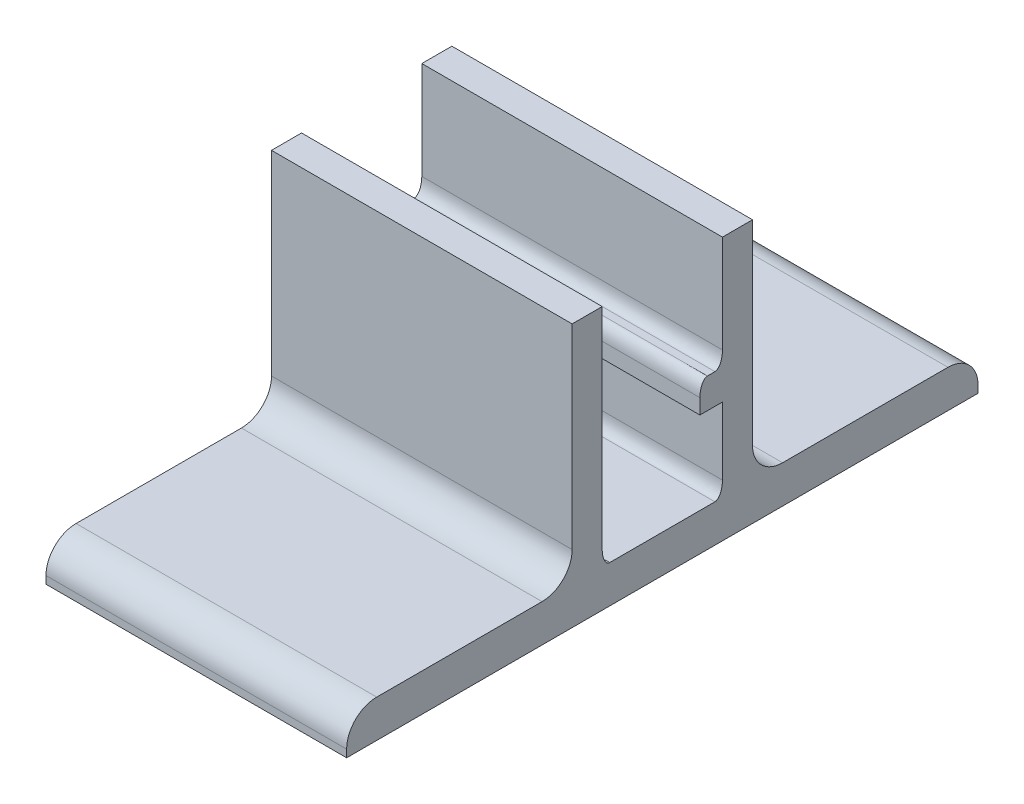
ISO-10303-21;
HEADER;
FILE_DESCRIPTION(('STEP AP214'),'2;1');
FILE_NAME('part.step','',(''),(''),'','','');
FILE_SCHEMA(('AUTOMOTIVE_DESIGN { 1 0 10303 214 1 1 1 1 }'));
ENDSEC;
DATA;
#1=APPLICATION_CONTEXT('core data for automotive mechanical design processes');
#2=APPLICATION_PROTOCOL_DEFINITION('international standard','automotive_design',2000,#1);
#3=PRODUCT_CONTEXT('',#1,'mechanical');
#4=PRODUCT('Part','Part','',(#3));
#5=PRODUCT_RELATED_PRODUCT_CATEGORY('part','',(#4));
#6=PRODUCT_DEFINITION_FORMATION('','',#4);
#7=PRODUCT_DEFINITION_CONTEXT('part definition',#1,'design');
#8=PRODUCT_DEFINITION('design','',#6,#7);
#9=PRODUCT_DEFINITION_SHAPE('','',#8);
#10=(LENGTH_UNIT() NAMED_UNIT(*) SI_UNIT(.MILLI.,.METRE.));
#11=(NAMED_UNIT(*) PLANE_ANGLE_UNIT() SI_UNIT($,.RADIAN.));
#12=(NAMED_UNIT(*) SI_UNIT($,.STERADIAN.) SOLID_ANGLE_UNIT());
#13=UNCERTAINTY_MEASURE_WITH_UNIT(LENGTH_MEASURE(1.E-05),#10,'distance_accuracy_value','');
#14=(GEOMETRIC_REPRESENTATION_CONTEXT(3) GLOBAL_UNCERTAINTY_ASSIGNED_CONTEXT((#13)) GLOBAL_UNIT_ASSIGNED_CONTEXT((#10,
#11,#12)) REPRESENTATION_CONTEXT('',''));
#15=CARTESIAN_POINT('',(0.,0.,0.));
#16=DIRECTION('',(0.,0.,1.));
#17=DIRECTION('',(1.,0.,0.));
#18=AXIS2_PLACEMENT_3D('',#15,#16,#17);
#19=CARTESIAN_POINT('',(50.8,6.35,-63.5));
#20=DIRECTION('',(0.,0.,-1.));
#21=DIRECTION('',(-1.,0.,0.));
#22=AXIS2_PLACEMENT_3D('',#19,#20,#21);
#23=PLANE('',#22);
#24=DIRECTION('',(0.,-1.,0.));
#25=VECTOR('',#24,1.);
#26=CARTESIAN_POINT('',(0.,6.35,-63.5));
#27=LINE('',#26,#25);
#28=CARTESIAN_POINT('',(0.,20.32,-63.5));
#29=VERTEX_POINT('',#28);
#30=CARTESIAN_POINT('',(0.,8.89,-63.5));
#31=VERTEX_POINT('',#30);
#32=EDGE_CURVE('E240',#29,#31,#27,.T.);
#33=ORIENTED_EDGE('',*,*,#32,.T.);
#34=CARTESIAN_POINT('',(53.34,8.89,-63.5));
#35=CARTESIAN_POINT('',(34.7133333333333,8.89,-63.5));
#36=CARTESIAN_POINT('',(16.0866666666666,8.89,-63.5));
#37=CARTESIAN_POINT('',(-2.54,8.89,-63.5));
#38=(BOUNDED_CURVE() B_SPLINE_CURVE(3,(#34,#35,#36,#37),.UNSPECIFIED.,.F.,
.F.) B_SPLINE_CURVE_WITH_KNOTS((4,4),(-0.05334,0.00254),
.UNSPECIFIED.) CURVE() GEOMETRIC_REPRESENTATION_ITEM() RATIONAL_B_SPLINE_CURVE((1.,1.,1.,1.)) REPRESENTATION_ITEM(''));
#39=CARTESIAN_POINT('',(50.8,8.89,-63.5));
#40=VERTEX_POINT('',#39);
#41=EDGE_CURVE('E672',#31,#40,#38,.F.);
#42=ORIENTED_EDGE('',*,*,#41,.T.);
#43=DIRECTION('',(0.,-1.,0.));
#44=VECTOR('',#43,1.);
#45=CARTESIAN_POINT('',(50.8,6.35,-63.5));
#46=LINE('',#45,#44);
#47=CARTESIAN_POINT('',(50.8,20.32,-63.5));
#48=VERTEX_POINT('',#47);
#49=EDGE_CURVE('E305',#48,#40,#46,.T.);
#50=ORIENTED_EDGE('',*,*,#49,.F.);
#51=DIRECTION('',(1.,0.,0.));
#52=VECTOR('',#51,1.);
#53=CARTESIAN_POINT('',(0.,20.32,-63.5));
#54=LINE('',#53,#52);
#55=EDGE_CURVE('E237',#29,#48,#54,.T.);
#56=ORIENTED_EDGE('',*,*,#55,.F.);
#57=EDGE_LOOP('',(#33,#42,#50,#56));
#58=FACE_BOUND('',#57,.T.);
#59=ADVANCED_FACE('F48',(#58),#23,.F.);
#60=CARTESIAN_POINT('',(50.8,6.35,0.));
#61=DIRECTION('',(0.,0.,-1.));
#62=DIRECTION('',(0.,1.,0.));
#63=AXIS2_PLACEMENT_3D('',#60,#61,#62);
#64=PLANE('',#63);
#65=DIRECTION('',(0.,-1.,0.));
#66=VECTOR('',#65,1.);
#67=CARTESIAN_POINT('',(50.8,6.35,0.));
#68=LINE('',#67,#66);
#69=CARTESIAN_POINT('',(50.8,1.27,0.));
#70=VERTEX_POINT('',#69);
#71=CARTESIAN_POINT('',(50.8,0.,0.));
#72=VERTEX_POINT('',#71);
#73=EDGE_CURVE('E759',#70,#72,#68,.T.);
#74=ORIENTED_EDGE('',*,*,#73,.F.);
#75=DIRECTION('',(-1.,0.,0.));
#76=VECTOR('',#75,1.);
#77=CARTESIAN_POINT('',(50.8,1.27,0.));
#78=LINE('',#77,#76);
#79=CARTESIAN_POINT('',(0.,1.27,0.));
#80=VERTEX_POINT('',#79);
#81=EDGE_CURVE('E413',#70,#80,#78,.T.);
#82=ORIENTED_EDGE('',*,*,#81,.T.);
#83=DIRECTION('',(0.,-1.,0.));
#84=VECTOR('',#83,1.);
#85=CARTESIAN_POINT('',(0.,6.35,0.));
#86=LINE('',#85,#84);
#87=CARTESIAN_POINT('',(0.,0.,0.));
#88=VERTEX_POINT('',#87);
#89=EDGE_CURVE('E779',#80,#88,#86,.T.);
#90=ORIENTED_EDGE('',*,*,#89,.T.);
#91=DIRECTION('',(-1.,0.,0.));
#92=VECTOR('',#91,1.);
#93=CARTESIAN_POINT('',(50.8,0.,0.));
#94=LINE('',#93,#92);
#95=EDGE_CURVE('E373',#72,#88,#94,.T.);
#96=ORIENTED_EDGE('',*,*,#95,.F.);
#97=EDGE_LOOP('',(#74,#82,#90,#96));
#98=FACE_BOUND('',#97,.T.);
#99=ADVANCED_FACE('F814',(#98),#64,.F.);
#100=CARTESIAN_POINT('',(50.8,0.,0.));
#101=DIRECTION('',(0.,1.,0.));
#102=DIRECTION('',(0.,0.,1.));
#103=AXIS2_PLACEMENT_3D('',#100,#101,#102);
#104=PLANE('',#103);
#105=DIRECTION('',(0.,0.,-1.));
#106=VECTOR('',#105,1.);
#107=CARTESIAN_POINT('',(0.,0.,0.));
#108=LINE('',#107,#106);
#109=CARTESIAN_POINT('',(0.,0.,-106.68));
#110=VERTEX_POINT('',#109);
#111=EDGE_CURVE('E452',#88,#110,#108,.T.);
#112=ORIENTED_EDGE('',*,*,#111,.T.);
#113=DIRECTION('',(-1.,0.,0.));
#114=VECTOR('',#113,1.);
#115=CARTESIAN_POINT('',(50.8,0.,-106.68));
#116=LINE('',#115,#114);
#117=CARTESIAN_POINT('',(50.8,0.,-106.68));
#118=VERTEX_POINT('',#117);
#119=EDGE_CURVE('E363',#118,#110,#116,.T.);
#120=ORIENTED_EDGE('',*,*,#119,.F.);
#121=DIRECTION('',(0.,0.,-1.));
#122=VECTOR('',#121,1.);
#123=CARTESIAN_POINT('',(50.8,0.,0.));
#124=LINE('',#123,#122);
#125=EDGE_CURVE('E799',#72,#118,#124,.T.);
#126=ORIENTED_EDGE('',*,*,#125,.F.);
#127=ORIENTED_EDGE('',*,*,#95,.T.);
#128=EDGE_LOOP('',(#112,#120,#126,#127));
#129=FACE_BOUND('',#128,.T.);
#130=ADVANCED_FACE('F785',(#129),#104,.F.);
#131=CARTESIAN_POINT('',(50.8,0.,-106.68));
#132=DIRECTION('',(0.,0.,1.));
#133=DIRECTION('',(1.,0.,0.));
#134=AXIS2_PLACEMENT_3D('',#131,#132,#133);
#135=PLANE('',#134);
#136=DIRECTION('',(0.,1.,0.));
#137=VECTOR('',#136,1.);
#138=CARTESIAN_POINT('',(0.,0.,-106.68));
#139=LINE('',#138,#137);
#140=CARTESIAN_POINT('',(0.,1.27,-106.68));
#141=VERTEX_POINT('',#140);
#142=EDGE_CURVE('E446',#110,#141,#139,.T.);
#143=ORIENTED_EDGE('',*,*,#142,.T.);
#144=DIRECTION('',(-1.,0.,0.));
#145=VECTOR('',#144,1.);
#146=CARTESIAN_POINT('',(50.8,1.27,-106.68));
#147=LINE('',#146,#145);
#148=CARTESIAN_POINT('',(50.8,1.27,-106.68));
#149=VERTEX_POINT('',#148);
#150=EDGE_CURVE('E404',#141,#149,#147,.F.);
#151=ORIENTED_EDGE('',*,*,#150,.T.);
#152=DIRECTION('',(0.,1.,0.));
#153=VECTOR('',#152,1.);
#154=CARTESIAN_POINT('',(50.8,0.,-106.68));
#155=LINE('',#154,#153);
#156=EDGE_CURVE('E795',#118,#149,#155,.T.);
#157=ORIENTED_EDGE('',*,*,#156,.F.);
#158=ORIENTED_EDGE('',*,*,#119,.T.);
#159=EDGE_LOOP('',(#143,#151,#157,#158));
#160=FACE_BOUND('',#159,.T.);
#161=ADVANCED_FACE('F792',(#160),#135,.F.);
#162=CARTESIAN_POINT('',(50.8,6.35,-68.58));
#163=DIRECTION('',(0.,-1.,0.));
#164=DIRECTION('',(0.,0.,-1.));
#165=AXIS2_PLACEMENT_3D('',#162,#163,#164);
#166=PLANE('',#165);
#167=DIRECTION('',(0.,0.,1.));
#168=VECTOR('',#167,1.);
#169=CARTESIAN_POINT('',(0.,6.35,-68.58));
#170=LINE('',#169,#168);
#171=CARTESIAN_POINT('',(0.,6.35,-101.6));
#172=VERTEX_POINT('',#171);
#173=CARTESIAN_POINT('',(0.,6.35,-73.66));
#174=VERTEX_POINT('',#173);
#175=EDGE_CURVE('E440',#172,#174,#170,.T.);
#176=ORIENTED_EDGE('',*,*,#175,.T.);
#177=DIRECTION('',(-1.,0.,0.));
#178=VECTOR('',#177,1.);
#179=CARTESIAN_POINT('',(50.8,6.35,-73.66));
#180=LINE('',#179,#178);
#181=CARTESIAN_POINT('',(50.8,6.35,-73.66));
#182=VERTEX_POINT('',#181);
#183=EDGE_CURVE('E395',#174,#182,#180,.F.);
#184=ORIENTED_EDGE('',*,*,#183,.T.);
#185=DIRECTION('',(0.,0.,1.));
#186=VECTOR('',#185,1.);
#187=CARTESIAN_POINT('',(50.8,6.35,-68.58));
#188=LINE('',#187,#186);
#189=CARTESIAN_POINT('',(50.8,6.35,-101.6));
#190=VERTEX_POINT('',#189);
#191=EDGE_CURVE('E429',#190,#182,#188,.T.);
#192=ORIENTED_EDGE('',*,*,#191,.F.);
#193=DIRECTION('',(-1.,0.,0.));
#194=VECTOR('',#193,1.);
#195=CARTESIAN_POINT('',(50.8,6.35,-101.6));
#196=LINE('',#195,#194);
#197=EDGE_CURVE('E391',#190,#172,#196,.T.);
#198=ORIENTED_EDGE('',*,*,#197,.T.);
#199=EDGE_LOOP('',(#176,#184,#192,#198));
#200=FACE_BOUND('',#199,.T.);
#201=ADVANCED_FACE('F443',(#200),#166,.F.);
#202=CARTESIAN_POINT('',(50.8,44.45,-68.58));
#203=DIRECTION('',(0.,0.,1.));
#204=DIRECTION('',(1.,0.,0.));
#205=AXIS2_PLACEMENT_3D('',#202,#203,#204);
#206=PLANE('',#205);
#207=DIRECTION('',(0.,1.,0.));
#208=VECTOR('',#207,1.);
#209=CARTESIAN_POINT('',(50.8,44.45,-68.58));
#210=LINE('',#209,#208);
#211=CARTESIAN_POINT('',(50.8,11.43,-68.58));
#212=VERTEX_POINT('',#211);
#213=CARTESIAN_POINT('',(50.8,44.45,-68.58));
#214=VERTEX_POINT('',#213);
#215=EDGE_CURVE('E348',#212,#214,#210,.T.);
#216=ORIENTED_EDGE('',*,*,#215,.F.);
#217=DIRECTION('',(-1.,0.,0.));
#218=VECTOR('',#217,1.);
#219=CARTESIAN_POINT('',(0.,11.43,-68.58));
#220=LINE('',#219,#218);
#221=CARTESIAN_POINT('',(0.,11.43,-68.58));
#222=VERTEX_POINT('',#221);
#223=EDGE_CURVE('E387',#212,#222,#220,.T.);
#224=ORIENTED_EDGE('',*,*,#223,.T.);
#225=DIRECTION('',(0.,1.,0.));
#226=VECTOR('',#225,1.);
#227=CARTESIAN_POINT('',(0.,44.45,-68.58));
#228=LINE('',#227,#226);
#229=CARTESIAN_POINT('',(0.,44.45,-68.58));
#230=VERTEX_POINT('',#229);
#231=EDGE_CURVE('E441',#222,#230,#228,.T.);
#232=ORIENTED_EDGE('',*,*,#231,.T.);
#233=DIRECTION('',(-1.,0.,0.));
#234=VECTOR('',#233,1.);
#235=CARTESIAN_POINT('',(50.8,44.45,-68.58));
#236=LINE('',#235,#234);
#237=EDGE_CURVE('E358',#214,#230,#236,.T.);
#238=ORIENTED_EDGE('',*,*,#237,.F.);
#239=EDGE_LOOP('',(#216,#224,#232,#238));
#240=FACE_BOUND('',#239,.T.);
#241=ADVANCED_FACE('F434',(#240),#206,.F.);
#242=CARTESIAN_POINT('',(50.8,44.45,-63.5));
#243=DIRECTION('',(0.,-1.,0.));
#244=DIRECTION('',(0.,0.,-1.));
#245=AXIS2_PLACEMENT_3D('',#242,#243,#244);
#246=PLANE('',#245);
#247=DIRECTION('',(0.,0.,1.));
#248=VECTOR('',#247,1.);
#249=CARTESIAN_POINT('',(0.,44.45,-63.5));
#250=LINE('',#249,#248);
#251=CARTESIAN_POINT('',(0.,44.45,-63.5));
#252=VERTEX_POINT('',#251);
#253=EDGE_CURVE('E356',#230,#252,#250,.T.);
#254=ORIENTED_EDGE('',*,*,#253,.T.);
#255=DIRECTION('',(-1.,0.,0.));
#256=VECTOR('',#255,1.);
#257=CARTESIAN_POINT('',(50.8,44.45,-63.5));
#258=LINE('',#257,#256);
#259=CARTESIAN_POINT('',(50.8,44.45,-63.5));
#260=VERTEX_POINT('',#259);
#261=EDGE_CURVE('E353',#260,#252,#258,.T.);
#262=ORIENTED_EDGE('',*,*,#261,.F.);
#263=DIRECTION('',(0.,0.,1.));
#264=VECTOR('',#263,1.);
#265=CARTESIAN_POINT('',(50.8,44.45,-63.5));
#266=LINE('',#265,#264);
#267=EDGE_CURVE('E311',#214,#260,#266,.T.);
#268=ORIENTED_EDGE('',*,*,#267,.F.);
#269=ORIENTED_EDGE('',*,*,#237,.T.);
#270=EDGE_LOOP('',(#254,#262,#268,#269));
#271=FACE_BOUND('',#270,.T.);
#272=ADVANCED_FACE('F354',(#271),#246,.F.);
#273=CARTESIAN_POINT('',(0.,27.94,-63.5));
#274=VERTEX_POINT('',#273);
#275=EDGE_CURVE('E325',#252,#274,#27,.T.);
#276=ORIENTED_EDGE('',*,*,#275,.T.);
#277=CARTESIAN_POINT('',(53.34,27.94,-63.5));
#278=CARTESIAN_POINT('',(34.7133333333333,27.94,-63.5));
#279=CARTESIAN_POINT('',(16.0866666666666,27.94,-63.5));
#280=CARTESIAN_POINT('',(-2.54,27.94,-63.5));
#281=(BOUNDED_CURVE() B_SPLINE_CURVE(3,(#277,#278,#279,#280),.UNSPECIFIED.,.F.,
.F.) B_SPLINE_CURVE_WITH_KNOTS((4,4),(-0.05334,0.00254),
.UNSPECIFIED.) CURVE() GEOMETRIC_REPRESENTATION_ITEM() RATIONAL_B_SPLINE_CURVE((1.,1.,1.,1.)) REPRESENTATION_ITEM(''));
#282=CARTESIAN_POINT('',(50.8,27.94,-63.5));
#283=VERTEX_POINT('',#282);
#284=EDGE_CURVE('E333',#274,#283,#281,.F.);
#285=ORIENTED_EDGE('',*,*,#284,.T.);
#286=EDGE_CURVE('E310',#260,#283,#46,.T.);
#287=ORIENTED_EDGE('',*,*,#286,.F.);
#288=ORIENTED_EDGE('',*,*,#261,.T.);
#289=EDGE_LOOP('',(#276,#285,#287,#288));
#290=FACE_BOUND('',#289,.T.);
#291=ADVANCED_FACE('F334',(#290),#23,.F.);
#292=CARTESIAN_POINT('',(50.8,6.35,-43.18));
#293=DIRECTION('',(0.,-1.,0.));
#294=DIRECTION('',(0.,0.,-1.));
#295=AXIS2_PLACEMENT_3D('',#292,#293,#294);
#296=PLANE('',#295);
#297=DIRECTION('',(0.,0.,1.));
#298=VECTOR('',#297,1.);
#299=CARTESIAN_POINT('',(50.8,6.35,-43.18));
#300=LINE('',#299,#298);
#301=CARTESIAN_POINT('',(50.8,6.35,-62.23));
#302=VERTEX_POINT('',#301);
#303=CARTESIAN_POINT('',(50.8,6.35,-44.45));
#304=VERTEX_POINT('',#303);
#305=EDGE_CURVE('E312',#302,#304,#300,.T.);
#306=ORIENTED_EDGE('',*,*,#305,.F.);
#307=CARTESIAN_POINT('',(-2.54,6.35,-62.23));
#308=CARTESIAN_POINT('',(16.0866666666666,6.35,-62.23));
#309=CARTESIAN_POINT('',(34.7133333333333,6.35,-62.23));
#310=CARTESIAN_POINT('',(53.34,6.35,-62.23));
#311=(BOUNDED_CURVE() B_SPLINE_CURVE(3,(#307,#308,#309,#310),.UNSPECIFIED.,.F.,
.F.) B_SPLINE_CURVE_WITH_KNOTS((4,4),(-0.05334,0.00254),
.UNSPECIFIED.) CURVE() GEOMETRIC_REPRESENTATION_ITEM() RATIONAL_B_SPLINE_CURVE((1.,1.,1.,1.)) REPRESENTATION_ITEM(''));
#312=CARTESIAN_POINT('',(0.,6.35,-62.23));
#313=VERTEX_POINT('',#312);
#314=EDGE_CURVE('E715',#302,#313,#311,.F.);
#315=ORIENTED_EDGE('',*,*,#314,.T.);
#316=DIRECTION('',(0.,0.,1.));
#317=VECTOR('',#316,1.);
#318=CARTESIAN_POINT('',(0.,6.35,-43.18));
#319=LINE('',#318,#317);
#320=CARTESIAN_POINT('',(0.,6.35,-44.45));
#321=VERTEX_POINT('',#320);
#322=EDGE_CURVE('E466',#313,#321,#319,.T.);
#323=ORIENTED_EDGE('',*,*,#322,.T.);
#324=CARTESIAN_POINT('',(53.34,6.35,-44.45));
#325=CARTESIAN_POINT('',(34.7133333333333,6.35,-44.45));
#326=CARTESIAN_POINT('',(16.0866666666666,6.35,-44.45));
#327=CARTESIAN_POINT('',(-2.54,6.35,-44.45));
#328=(BOUNDED_CURVE() B_SPLINE_CURVE(3,(#324,#325,#326,#327),.UNSPECIFIED.,.F.,
.F.) B_SPLINE_CURVE_WITH_KNOTS((4,4),(-0.05334,0.00254),
.UNSPECIFIED.) CURVE() GEOMETRIC_REPRESENTATION_ITEM() RATIONAL_B_SPLINE_CURVE((1.,1.,1.,1.)) REPRESENTATION_ITEM(''));
#329=EDGE_CURVE('E712',#321,#304,#328,.F.);
#330=ORIENTED_EDGE('',*,*,#329,.T.);
#331=EDGE_LOOP('',(#306,#315,#323,#330));
#332=FACE_BOUND('',#331,.T.);
#333=ADVANCED_FACE('F738',(#332),#296,.F.);
#334=CARTESIAN_POINT('',(50.8,44.45,-43.18));
#335=DIRECTION('',(0.,0.,1.));
#336=DIRECTION('',(0.,-1.,0.));
#337=AXIS2_PLACEMENT_3D('',#334,#335,#336);
#338=PLANE('',#337);
#339=DIRECTION('',(0.,1.,0.));
#340=VECTOR('',#339,1.);
#341=CARTESIAN_POINT('',(50.8,44.45,-43.18));
#342=LINE('',#341,#340);
#343=CARTESIAN_POINT('',(50.8,8.89000000000003,-43.18));
#344=VERTEX_POINT('',#343);
#345=CARTESIAN_POINT('',(50.8,44.45,-43.18));
#346=VERTEX_POINT('',#345);
#347=EDGE_CURVE('E1117',#344,#346,#342,.T.);
#348=ORIENTED_EDGE('',*,*,#347,.F.);
#349=CARTESIAN_POINT('',(-2.54,8.89,-43.18));
#350=CARTESIAN_POINT('',(16.0866666666666,8.89,-43.18));
#351=CARTESIAN_POINT('',(34.7133333333333,8.89,-43.18));
#352=CARTESIAN_POINT('',(53.34,8.89,-43.18));
#353=(BOUNDED_CURVE() B_SPLINE_CURVE(3,(#349,#350,#351,#352),.UNSPECIFIED.,.F.,
.F.) B_SPLINE_CURVE_WITH_KNOTS((4,4),(-0.05334,0.00254),
.UNSPECIFIED.) CURVE() GEOMETRIC_REPRESENTATION_ITEM() RATIONAL_B_SPLINE_CURVE((1.,1.,1.,1.)) REPRESENTATION_ITEM(''));
#354=CARTESIAN_POINT('',(0.,8.89000000000003,-43.18));
#355=VERTEX_POINT('',#354);
#356=EDGE_CURVE('E695',#344,#355,#353,.F.);
#357=ORIENTED_EDGE('',*,*,#356,.T.);
#358=DIRECTION('',(0.,1.,0.));
#359=VECTOR('',#358,1.);
#360=CARTESIAN_POINT('',(0.,44.45,-43.18));
#361=LINE('',#360,#359);
#362=CARTESIAN_POINT('',(0.,44.45,-43.18));
#363=VERTEX_POINT('',#362);
#364=EDGE_CURVE('E740',#355,#363,#361,.T.);
#365=ORIENTED_EDGE('',*,*,#364,.T.);
#366=DIRECTION('',(-1.,0.,0.));
#367=VECTOR('',#366,1.);
#368=CARTESIAN_POINT('',(50.8,44.45,-43.18));
#369=LINE('',#368,#367);
#370=EDGE_CURVE('E359',#346,#363,#369,.T.);
#371=ORIENTED_EDGE('',*,*,#370,.F.);
#372=EDGE_LOOP('',(#348,#357,#365,#371));
#373=FACE_BOUND('',#372,.T.);
#374=ADVANCED_FACE('F837',(#373),#338,.F.);
#375=CARTESIAN_POINT('',(50.8,44.45,-38.1));
#376=DIRECTION('',(0.,-1.,0.));
#377=DIRECTION('',(0.,0.,-1.));
#378=AXIS2_PLACEMENT_3D('',#375,#376,#377);
#379=PLANE('',#378);
#380=DIRECTION('',(0.,0.,1.));
#381=VECTOR('',#380,1.);
#382=CARTESIAN_POINT('',(0.,44.45,-38.1));
#383=LINE('',#382,#381);
#384=CARTESIAN_POINT('',(0.,44.45,-38.1));
#385=VERTEX_POINT('',#384);
#386=EDGE_CURVE('E743',#363,#385,#383,.T.);
#387=ORIENTED_EDGE('',*,*,#386,.T.);
#388=DIRECTION('',(-1.,0.,0.));
#389=VECTOR('',#388,1.);
#390=CARTESIAN_POINT('',(50.8,44.45,-38.1));
#391=LINE('',#390,#389);
#392=CARTESIAN_POINT('',(50.8,44.45,-38.1));
#393=VERTEX_POINT('',#392);
#394=EDGE_CURVE('E366',#393,#385,#391,.T.);
#395=ORIENTED_EDGE('',*,*,#394,.F.);
#396=DIRECTION('',(0.,0.,1.));
#397=VECTOR('',#396,1.);
#398=CARTESIAN_POINT('',(50.8,44.45,-38.1));
#399=LINE('',#398,#397);
#400=EDGE_CURVE('E775',#346,#393,#399,.T.);
#401=ORIENTED_EDGE('',*,*,#400,.F.);
#402=ORIENTED_EDGE('',*,*,#370,.T.);
#403=EDGE_LOOP('',(#387,#395,#401,#402));
#404=FACE_BOUND('',#403,.T.);
#405=ADVANCED_FACE('F896',(#404),#379,.F.);
#406=CARTESIAN_POINT('',(50.8,6.35,-38.1));
#407=DIRECTION('',(0.,0.,-1.));
#408=DIRECTION('',(-1.,0.,0.));
#409=AXIS2_PLACEMENT_3D('',#406,#407,#408);
#410=PLANE('',#409);
#411=DIRECTION('',(0.,-1.,0.));
#412=VECTOR('',#411,1.);
#413=CARTESIAN_POINT('',(0.,6.35,-38.1));
#414=LINE('',#413,#412);
#415=CARTESIAN_POINT('',(0.,11.43,-38.1));
#416=VERTEX_POINT('',#415);
#417=EDGE_CURVE('E746',#385,#416,#414,.T.);
#418=ORIENTED_EDGE('',*,*,#417,.T.);
#419=DIRECTION('',(-1.,0.,0.));
#420=VECTOR('',#419,1.);
#421=CARTESIAN_POINT('',(50.8,11.43,-38.1));
#422=LINE('',#421,#420);
#423=CARTESIAN_POINT('',(50.8,11.43,-38.1));
#424=VERTEX_POINT('',#423);
#425=EDGE_CURVE('E384',#416,#424,#422,.F.);
#426=ORIENTED_EDGE('',*,*,#425,.T.);
#427=DIRECTION('',(0.,-1.,0.));
#428=VECTOR('',#427,1.);
#429=CARTESIAN_POINT('',(50.8,6.35,-38.1));
#430=LINE('',#429,#428);
#431=EDGE_CURVE('E769',#393,#424,#430,.T.);
#432=ORIENTED_EDGE('',*,*,#431,.F.);
#433=ORIENTED_EDGE('',*,*,#394,.T.);
#434=EDGE_LOOP('',(#418,#426,#432,#433));
#435=FACE_BOUND('',#434,.T.);
#436=ADVANCED_FACE('F1020',(#435),#410,.F.);
#437=CARTESIAN_POINT('',(50.8,6.35,0.));
#438=DIRECTION('',(0.,-1.,0.));
#439=DIRECTION('',(0.,0.,-1.));
#440=AXIS2_PLACEMENT_3D('',#437,#438,#439);
#441=PLANE('',#440);
#442=DIRECTION('',(0.,0.,1.));
#443=VECTOR('',#442,1.);
#444=CARTESIAN_POINT('',(50.8,6.35,0.));
#445=LINE('',#444,#443);
#446=CARTESIAN_POINT('',(50.8,6.35,-33.02));
#447=VERTEX_POINT('',#446);
#448=CARTESIAN_POINT('',(50.8,6.35,-5.08));
#449=VERTEX_POINT('',#448);
#450=EDGE_CURVE('E762',#447,#449,#445,.T.);
#451=ORIENTED_EDGE('',*,*,#450,.F.);
#452=DIRECTION('',(-1.,0.,0.));
#453=VECTOR('',#452,1.);
#454=CARTESIAN_POINT('',(0.,6.35,-33.02));
#455=LINE('',#454,#453);
#456=CARTESIAN_POINT('',(0.,6.35,-33.02));
#457=VERTEX_POINT('',#456);
#458=EDGE_CURVE('E380',#447,#457,#455,.T.);
#459=ORIENTED_EDGE('',*,*,#458,.T.);
#460=DIRECTION('',(0.,0.,1.));
#461=VECTOR('',#460,1.);
#462=CARTESIAN_POINT('',(0.,6.35,0.));
#463=LINE('',#462,#461);
#464=CARTESIAN_POINT('',(0.,6.35,-5.08));
#465=VERTEX_POINT('',#464);
#466=EDGE_CURVE('E756',#457,#465,#463,.T.);
#467=ORIENTED_EDGE('',*,*,#466,.T.);
#468=DIRECTION('',(-1.,0.,0.));
#469=VECTOR('',#468,1.);
#470=CARTESIAN_POINT('',(50.8,6.35,-5.08));
#471=LINE('',#470,#469);
#472=EDGE_CURVE('E377',#465,#449,#471,.F.);
#473=ORIENTED_EDGE('',*,*,#472,.T.);
#474=EDGE_LOOP('',(#451,#459,#467,#473));
#475=FACE_BOUND('',#474,.T.);
#476=ADVANCED_FACE('F483',(#475),#441,.F.);
#477=CARTESIAN_POINT('',(50.8,0.,0.));
#478=DIRECTION('',(1.,0.,0.));
#479=DIRECTION('',(0.,0.,-1.));
#480=AXIS2_PLACEMENT_3D('',#477,#478,#479);
#481=PLANE('',#480);
#482=DIRECTION('',(0.,0.,1.));
#483=VECTOR('',#482,1.);
#484=CARTESIAN_POINT('',(50.8,25.4,-63.5));
#485=LINE('',#484,#483);
#486=CARTESIAN_POINT('',(50.8,25.4,-62.23));
#487=VERTEX_POINT('',#486);
#488=CARTESIAN_POINT('',(50.8,25.4,-60.96));
#489=VERTEX_POINT('',#488);
#490=EDGE_CURVE('E253',#487,#489,#485,.T.);
#491=ORIENTED_EDGE('',*,*,#490,.T.);
#492=CARTESIAN_POINT('',(50.8,22.86,-59.69));
#493=CARTESIAN_POINT('',(50.8,25.4,-59.69));
#494=CARTESIAN_POINT('',(50.8,25.4,-60.96));
#495=(BOUNDED_CURVE() B_SPLINE_CURVE(2,(#492,#493,#494),.UNSPECIFIED.,.F.,
.F.) B_SPLINE_CURVE_WITH_KNOTS((3,3),(0.,1.),
.UNSPECIFIED.) CURVE() GEOMETRIC_REPRESENTATION_ITEM() RATIONAL_B_SPLINE_CURVE((1.,
0.707106781186548,1.)) REPRESENTATION_ITEM(''));
#496=CARTESIAN_POINT('',(50.8,22.86,-59.69));
#497=VERTEX_POINT('',#496);
#498=EDGE_CURVE('E593',#489,#497,#495,.F.);
#499=ORIENTED_EDGE('',*,*,#498,.T.);
#500=DIRECTION('',(0.,-1.,0.));
#501=VECTOR('',#500,1.);
#502=CARTESIAN_POINT('',(50.8,20.32,-59.69));
#503=LINE('',#502,#501);
#504=CARTESIAN_POINT('',(50.8,20.32,-59.69));
#505=VERTEX_POINT('',#504);
#506=EDGE_CURVE('E258',#497,#505,#503,.T.);
#507=ORIENTED_EDGE('',*,*,#506,.T.);
#508=DIRECTION('',(0.,0.,-1.));
#509=VECTOR('',#508,1.);
#510=CARTESIAN_POINT('',(50.8,20.32,-63.5));
#511=LINE('',#510,#509);
#512=EDGE_CURVE('E235',#505,#48,#511,.T.);
#513=ORIENTED_EDGE('',*,*,#512,.T.);
#514=ORIENTED_EDGE('',*,*,#49,.T.);
#515=CARTESIAN_POINT('',(50.8,6.35,-62.23));
#516=CARTESIAN_POINT('',(50.8,6.35,-63.5));
#517=CARTESIAN_POINT('',(50.8,8.89,-63.5));
#518=(BOUNDED_CURVE() B_SPLINE_CURVE(2,(#515,#516,#517),.UNSPECIFIED.,.F.,
.F.) B_SPLINE_CURVE_WITH_KNOTS((3,3),(0.,1.),
.UNSPECIFIED.) CURVE() GEOMETRIC_REPRESENTATION_ITEM() RATIONAL_B_SPLINE_CURVE((1.,
0.707106781186548,1.)) REPRESENTATION_ITEM(''));
#519=EDGE_CURVE('E505',#40,#302,#518,.F.);
#520=ORIENTED_EDGE('',*,*,#519,.T.);
#521=ORIENTED_EDGE('',*,*,#305,.T.);
#522=CARTESIAN_POINT('',(50.8,8.89,-43.18));
#523=CARTESIAN_POINT('',(50.8,6.35,-43.18));
#524=CARTESIAN_POINT('',(50.8,6.35,-44.45));
#525=(BOUNDED_CURVE() B_SPLINE_CURVE(2,(#522,#523,#524),.UNSPECIFIED.,.F.,
.F.) B_SPLINE_CURVE_WITH_KNOTS((3,3),(0.,1.),
.UNSPECIFIED.) CURVE() GEOMETRIC_REPRESENTATION_ITEM() RATIONAL_B_SPLINE_CURVE((1.,
0.707106781186548,1.)) REPRESENTATION_ITEM(''));
#526=EDGE_CURVE('E12',#304,#344,#525,.F.);
#527=ORIENTED_EDGE('',*,*,#526,.T.);
#528=ORIENTED_EDGE('',*,*,#347,.T.);
#529=ORIENTED_EDGE('',*,*,#400,.T.);
#530=ORIENTED_EDGE('',*,*,#431,.T.);
#531=CARTESIAN_POINT('',(50.8,11.43,-33.02));
#532=DIRECTION('',(1.,0.,0.));
#533=DIRECTION('',(0.,0.,-1.));
#534=AXIS2_PLACEMENT_3D('',#531,#532,#533);
#535=CIRCLE('',#534,5.08);
#536=EDGE_CURVE('E420',#424,#447,#535,.F.);
#537=ORIENTED_EDGE('',*,*,#536,.T.);
#538=ORIENTED_EDGE('',*,*,#450,.T.);
#539=CARTESIAN_POINT('',(50.8,1.27,-5.08));
#540=DIRECTION('',(1.,0.,0.));
#541=DIRECTION('',(0.,0.,-1.));
#542=AXIS2_PLACEMENT_3D('',#539,#540,#541);
#543=CIRCLE('',#542,5.08);
#544=EDGE_CURVE('E407',#449,#70,#543,.T.);
#545=ORIENTED_EDGE('',*,*,#544,.T.);
#546=ORIENTED_EDGE('',*,*,#73,.T.);
#547=ORIENTED_EDGE('',*,*,#125,.T.);
#548=ORIENTED_EDGE('',*,*,#156,.T.);
#549=CARTESIAN_POINT('',(50.8,1.27,-101.6));
#550=DIRECTION('',(1.,0.,0.));
#551=DIRECTION('',(0.,0.,-1.));
#552=AXIS2_PLACEMENT_3D('',#549,#550,#551);
#553=CIRCLE('',#552,5.08);
#554=EDGE_CURVE('E410',#149,#190,#553,.T.);
#555=ORIENTED_EDGE('',*,*,#554,.T.);
#556=ORIENTED_EDGE('',*,*,#191,.T.);
#557=CARTESIAN_POINT('',(50.8,11.43,-73.66));
#558=DIRECTION('',(1.,0.,0.));
#559=DIRECTION('',(0.,0.,-1.));
#560=AXIS2_PLACEMENT_3D('',#557,#558,#559);
#561=CIRCLE('',#560,5.08);
#562=EDGE_CURVE('E341',#182,#212,#561,.F.);
#563=ORIENTED_EDGE('',*,*,#562,.T.);
#564=ORIENTED_EDGE('',*,*,#215,.T.);
#565=ORIENTED_EDGE('',*,*,#267,.T.);
#566=ORIENTED_EDGE('',*,*,#286,.T.);
#567=CARTESIAN_POINT('',(50.8,25.4,-62.23));
#568=CARTESIAN_POINT('',(50.8,25.4,-63.5));
#569=CARTESIAN_POINT('',(50.8,27.94,-63.5));
#570=(BOUNDED_CURVE() B_SPLINE_CURVE(2,(#567,#568,#569),.UNSPECIFIED.,.F.,
.F.) B_SPLINE_CURVE_WITH_KNOTS((3,3),(0.,1.),
.UNSPECIFIED.) CURVE() GEOMETRIC_REPRESENTATION_ITEM() RATIONAL_B_SPLINE_CURVE((1.,
0.707106781186548,1.)) REPRESENTATION_ITEM(''));
#571=EDGE_CURVE('E343',#283,#487,#570,.F.);
#572=ORIENTED_EDGE('',*,*,#571,.T.);
#573=EDGE_LOOP('',(#491,#499,#507,#513,#514,#520,#521,#527,#528,#529,#530,#537,#538,#545,#546,
#547,#548,#555,#556,#563,#564,#565,#566,#572));
#574=FACE_BOUND('',#573,.T.);
#575=ADVANCED_FACE('F291',(#574),#481,.T.);
#576=CARTESIAN_POINT('',(0.,0.,0.));
#577=DIRECTION('',(1.,0.,0.));
#578=DIRECTION('',(0.,0.,-1.));
#579=AXIS2_PLACEMENT_3D('',#576,#577,#578);
#580=PLANE('',#579);
#581=DIRECTION('',(0.,-1.,0.));
#582=VECTOR('',#581,1.);
#583=CARTESIAN_POINT('',(0.,20.32,-59.69));
#584=LINE('',#583,#582);
#585=CARTESIAN_POINT('',(0.,22.86,-59.69));
#586=VERTEX_POINT('',#585);
#587=CARTESIAN_POINT('',(0.,20.32,-59.69));
#588=VERTEX_POINT('',#587);
#589=EDGE_CURVE('E215',#586,#588,#584,.T.);
#590=ORIENTED_EDGE('',*,*,#589,.F.);
#591=CARTESIAN_POINT('',(0.,25.4,-60.96));
#592=CARTESIAN_POINT('',(0.,25.4,-59.69));
#593=CARTESIAN_POINT('',(0.,22.86,-59.69));
#594=(BOUNDED_CURVE() B_SPLINE_CURVE(2,(#591,#592,#593),.UNSPECIFIED.,.F.,
.F.) B_SPLINE_CURVE_WITH_KNOTS((3,3),(0.,1.),
.UNSPECIFIED.) CURVE() GEOMETRIC_REPRESENTATION_ITEM() RATIONAL_B_SPLINE_CURVE((1.,
0.707106781186548,1.)) REPRESENTATION_ITEM(''));
#595=CARTESIAN_POINT('',(0.,25.4,-60.96));
#596=VERTEX_POINT('',#595);
#597=EDGE_CURVE('E470',#586,#596,#594,.F.);
#598=ORIENTED_EDGE('',*,*,#597,.T.);
#599=DIRECTION('',(0.,0.,1.));
#600=VECTOR('',#599,1.);
#601=CARTESIAN_POINT('',(0.,25.4,-63.5));
#602=LINE('',#601,#600);
#603=CARTESIAN_POINT('',(0.,25.4,-62.23));
#604=VERTEX_POINT('',#603);
#605=EDGE_CURVE('E228',#604,#596,#602,.T.);
#606=ORIENTED_EDGE('',*,*,#605,.F.);
#607=CARTESIAN_POINT('',(0.,27.94,-63.5));
#608=CARTESIAN_POINT('',(0.,25.4,-63.5));
#609=CARTESIAN_POINT('',(0.,25.4,-62.23));
#610=(BOUNDED_CURVE() B_SPLINE_CURVE(2,(#607,#608,#609),.UNSPECIFIED.,.F.,
.F.) B_SPLINE_CURVE_WITH_KNOTS((3,3),(0.,1.),
.UNSPECIFIED.) CURVE() GEOMETRIC_REPRESENTATION_ITEM() RATIONAL_B_SPLINE_CURVE((1.,
0.707106781186548,1.)) REPRESENTATION_ITEM(''));
#611=EDGE_CURVE('E723',#604,#274,#610,.F.);
#612=ORIENTED_EDGE('',*,*,#611,.T.);
#613=ORIENTED_EDGE('',*,*,#275,.F.);
#614=ORIENTED_EDGE('',*,*,#253,.F.);
#615=ORIENTED_EDGE('',*,*,#231,.F.);
#616=CARTESIAN_POINT('',(0.,11.43,-73.66));
#617=DIRECTION('',(1.,0.,0.));
#618=DIRECTION('',(0.,0.,-1.));
#619=AXIS2_PLACEMENT_3D('',#616,#617,#618);
#620=CIRCLE('',#619,5.08);
#621=EDGE_CURVE('E423',#222,#174,#620,.T.);
#622=ORIENTED_EDGE('',*,*,#621,.T.);
#623=ORIENTED_EDGE('',*,*,#175,.F.);
#624=CARTESIAN_POINT('',(0.,1.27,-101.6));
#625=DIRECTION('',(1.,0.,0.));
#626=DIRECTION('',(0.,0.,-1.));
#627=AXIS2_PLACEMENT_3D('',#624,#625,#626);
#628=CIRCLE('',#627,5.08);
#629=EDGE_CURVE('E401',#172,#141,#628,.F.);
#630=ORIENTED_EDGE('',*,*,#629,.T.);
#631=ORIENTED_EDGE('',*,*,#142,.F.);
#632=ORIENTED_EDGE('',*,*,#111,.F.);
#633=ORIENTED_EDGE('',*,*,#89,.F.);
#634=CARTESIAN_POINT('',(0.,1.27,-5.08));
#635=DIRECTION('',(1.,0.,0.));
#636=DIRECTION('',(0.,0.,-1.));
#637=AXIS2_PLACEMENT_3D('',#634,#635,#636);
#638=CIRCLE('',#637,5.08);
#639=EDGE_CURVE('E398',#80,#465,#638,.F.);
#640=ORIENTED_EDGE('',*,*,#639,.T.);
#641=ORIENTED_EDGE('',*,*,#466,.F.);
#642=CARTESIAN_POINT('',(0.,11.43,-33.02));
#643=DIRECTION('',(1.,0.,0.));
#644=DIRECTION('',(0.,0.,-1.));
#645=AXIS2_PLACEMENT_3D('',#642,#643,#644);
#646=CIRCLE('',#645,5.08);
#647=EDGE_CURVE('E417',#457,#416,#646,.T.);
#648=ORIENTED_EDGE('',*,*,#647,.T.);
#649=ORIENTED_EDGE('',*,*,#417,.F.);
#650=ORIENTED_EDGE('',*,*,#386,.F.);
#651=ORIENTED_EDGE('',*,*,#364,.F.);
#652=CARTESIAN_POINT('',(0.,6.35,-44.45));
#653=CARTESIAN_POINT('',(0.,6.35,-43.18));
#654=CARTESIAN_POINT('',(0.,8.89,-43.18));
#655=(BOUNDED_CURVE() B_SPLINE_CURVE(2,(#652,#653,#654),.UNSPECIFIED.,.F.,
.F.) B_SPLINE_CURVE_WITH_KNOTS((3,3),(0.,1.),
.UNSPECIFIED.) CURVE() GEOMETRIC_REPRESENTATION_ITEM() RATIONAL_B_SPLINE_CURVE((1.,
0.707106781186548,1.)) REPRESENTATION_ITEM(''));
#656=EDGE_CURVE('E63',#355,#321,#655,.F.);
#657=ORIENTED_EDGE('',*,*,#656,.T.);
#658=ORIENTED_EDGE('',*,*,#322,.F.);
#659=CARTESIAN_POINT('',(0.,8.89,-63.5));
#660=CARTESIAN_POINT('',(0.,6.35,-63.5));
#661=CARTESIAN_POINT('',(0.,6.35,-62.23));
#662=(BOUNDED_CURVE() B_SPLINE_CURVE(2,(#659,#660,#661),.UNSPECIFIED.,.F.,
.F.) B_SPLINE_CURVE_WITH_KNOTS((3,3),(0.,1.),
.UNSPECIFIED.) CURVE() GEOMETRIC_REPRESENTATION_ITEM() RATIONAL_B_SPLINE_CURVE((1.,
0.707106781186548,1.)) REPRESENTATION_ITEM(''));
#663=EDGE_CURVE('E70',#313,#31,#662,.F.);
#664=ORIENTED_EDGE('',*,*,#663,.T.);
#665=ORIENTED_EDGE('',*,*,#32,.F.);
#666=DIRECTION('',(0.,0.,-1.));
#667=VECTOR('',#666,1.);
#668=CARTESIAN_POINT('',(0.,20.32,-63.5));
#669=LINE('',#668,#667);
#670=EDGE_CURVE('E227',#588,#29,#669,.T.);
#671=ORIENTED_EDGE('',*,*,#670,.F.);
#672=EDGE_LOOP('',(#590,#598,#606,#612,#613,#614,#615,#622,#623,#630,#631,#632,#633,#640,#641,
#648,#649,#650,#651,#657,#658,#664,#665,#671));
#673=FACE_BOUND('',#672,.T.);
#674=ADVANCED_FACE('F239',(#673),#580,.F.);
#675=CARTESIAN_POINT('',(0.,20.32,-63.5));
#676=DIRECTION('',(0.,-1.,0.));
#677=DIRECTION('',(0.,0.,-1.));
#678=AXIS2_PLACEMENT_3D('',#675,#676,#677);
#679=PLANE('',#678);
#680=ORIENTED_EDGE('',*,*,#512,.F.);
#681=DIRECTION('',(1.,0.,0.));
#682=VECTOR('',#681,1.);
#683=CARTESIAN_POINT('',(0.,20.32,-59.69));
#684=LINE('',#683,#682);
#685=EDGE_CURVE('E219',#588,#505,#684,.T.);
#686=ORIENTED_EDGE('',*,*,#685,.F.);
#687=ORIENTED_EDGE('',*,*,#670,.T.);
#688=ORIENTED_EDGE('',*,*,#55,.T.);
#689=EDGE_LOOP('',(#680,#686,#687,#688));
#690=FACE_BOUND('',#689,.T.);
#691=ADVANCED_FACE('F232',(#690),#679,.T.);
#692=CARTESIAN_POINT('',(0.,20.32,-59.69));
#693=DIRECTION('',(0.,0.,1.));
#694=DIRECTION('',(1.,0.,0.));
#695=AXIS2_PLACEMENT_3D('',#692,#693,#694);
#696=PLANE('',#695);
#697=ORIENTED_EDGE('',*,*,#506,.F.);
#698=CARTESIAN_POINT('',(-2.54,22.86,-59.69));
#699=CARTESIAN_POINT('',(16.0866666666666,22.86,-59.69));
#700=CARTESIAN_POINT('',(34.7133333333334,22.86,-59.69));
#701=CARTESIAN_POINT('',(53.34,22.86,-59.69));
#702=(BOUNDED_CURVE() B_SPLINE_CURVE(3,(#698,#699,#700,#701),.UNSPECIFIED.,.F.,
.F.) B_SPLINE_CURVE_WITH_KNOTS((4,4),(-0.00254,0.05334),
.UNSPECIFIED.) CURVE() GEOMETRIC_REPRESENTATION_ITEM() RATIONAL_B_SPLINE_CURVE((1.,1.,1.,1.)) REPRESENTATION_ITEM(''));
#703=EDGE_CURVE('E222',#497,#586,#702,.F.);
#704=ORIENTED_EDGE('',*,*,#703,.T.);
#705=ORIENTED_EDGE('',*,*,#589,.T.);
#706=ORIENTED_EDGE('',*,*,#685,.T.);
#707=EDGE_LOOP('',(#697,#704,#705,#706));
#708=FACE_BOUND('',#707,.T.);
#709=ADVANCED_FACE('F218',(#708),#696,.T.);
#710=CARTESIAN_POINT('',(0.,25.4,-63.5));
#711=DIRECTION('',(0.,1.,0.));
#712=DIRECTION('',(0.,0.,1.));
#713=AXIS2_PLACEMENT_3D('',#710,#711,#712);
#714=PLANE('',#713);
#715=ORIENTED_EDGE('',*,*,#490,.F.);
#716=CARTESIAN_POINT('',(-2.54,25.4,-62.23));
#717=CARTESIAN_POINT('',(16.0866666666666,25.4,-62.23));
#718=CARTESIAN_POINT('',(34.7133333333333,25.4,-62.23));
#719=CARTESIAN_POINT('',(53.34,25.4,-62.23));
#720=(BOUNDED_CURVE() B_SPLINE_CURVE(3,(#716,#717,#718,#719),.UNSPECIFIED.,.F.,
.F.) B_SPLINE_CURVE_WITH_KNOTS((4,4),(-0.05334,0.00254),
.UNSPECIFIED.) CURVE() GEOMETRIC_REPRESENTATION_ITEM() RATIONAL_B_SPLINE_CURVE((1.,1.,1.,1.)) REPRESENTATION_ITEM(''));
#721=EDGE_CURVE('E582',#487,#604,#720,.F.);
#722=ORIENTED_EDGE('',*,*,#721,.T.);
#723=ORIENTED_EDGE('',*,*,#605,.T.);
#724=CARTESIAN_POINT('',(53.34,25.4,-60.96));
#725=CARTESIAN_POINT('',(34.7133333333334,25.4,-60.96));
#726=CARTESIAN_POINT('',(16.0866666666666,25.4,-60.96));
#727=CARTESIAN_POINT('',(-2.54,25.4,-60.96));
#728=(BOUNDED_CURVE() B_SPLINE_CURVE(3,(#724,#725,#726,#727),.UNSPECIFIED.,.F.,
.F.) B_SPLINE_CURVE_WITH_KNOTS((4,4),(-0.00254,0.05334),
.UNSPECIFIED.) CURVE() GEOMETRIC_REPRESENTATION_ITEM() RATIONAL_B_SPLINE_CURVE((1.,1.,1.,1.)) REPRESENTATION_ITEM(''));
#729=EDGE_CURVE('E272',#596,#489,#728,.F.);
#730=ORIENTED_EDGE('',*,*,#729,.T.);
#731=EDGE_LOOP('',(#715,#722,#723,#730));
#732=FACE_BOUND('',#731,.T.);
#733=ADVANCED_FACE('F278',(#732),#714,.T.);
#734=CARTESIAN_POINT('',(50.8,11.43,-33.02));
#735=DIRECTION('',(1.,0.,0.));
#736=DIRECTION('',(0.,0.,-1.));
#737=AXIS2_PLACEMENT_3D('',#734,#735,#736);
#738=CYLINDRICAL_SURFACE('',#737,5.08);
#739=ORIENTED_EDGE('',*,*,#536,.F.);
#740=ORIENTED_EDGE('',*,*,#425,.F.);
#741=ORIENTED_EDGE('',*,*,#647,.F.);
#742=ORIENTED_EDGE('',*,*,#458,.F.);
#743=EDGE_LOOP('',(#739,#740,#741,#742));
#744=FACE_BOUND('',#743,.T.);
#745=ADVANCED_FACE('F288',(#744),#738,.F.);
#746=CARTESIAN_POINT('',(50.8,11.43,-73.66));
#747=DIRECTION('',(1.,0.,0.));
#748=DIRECTION('',(0.,0.,-1.));
#749=AXIS2_PLACEMENT_3D('',#746,#747,#748);
#750=CYLINDRICAL_SURFACE('',#749,5.08);
#751=ORIENTED_EDGE('',*,*,#562,.F.);
#752=ORIENTED_EDGE('',*,*,#183,.F.);
#753=ORIENTED_EDGE('',*,*,#621,.F.);
#754=ORIENTED_EDGE('',*,*,#223,.F.);
#755=EDGE_LOOP('',(#751,#752,#753,#754));
#756=FACE_BOUND('',#755,.T.);
#757=ADVANCED_FACE('F437',(#756),#750,.F.);
#758=CARTESIAN_POINT('',(50.8,1.27,-101.6));
#759=DIRECTION('',(-1.,0.,0.));
#760=DIRECTION('',(0.,0.,1.));
#761=AXIS2_PLACEMENT_3D('',#758,#759,#760);
#762=CYLINDRICAL_SURFACE('',#761,5.08);
#763=ORIENTED_EDGE('',*,*,#554,.F.);
#764=ORIENTED_EDGE('',*,*,#150,.F.);
#765=ORIENTED_EDGE('',*,*,#629,.F.);
#766=ORIENTED_EDGE('',*,*,#197,.F.);
#767=EDGE_LOOP('',(#763,#764,#765,#766));
#768=FACE_BOUND('',#767,.T.);
#769=ADVANCED_FACE('F798',(#768),#762,.T.);
#770=CARTESIAN_POINT('',(50.8,1.27,-5.08));
#771=DIRECTION('',(-1.,0.,0.));
#772=DIRECTION('',(0.,0.,1.));
#773=AXIS2_PLACEMENT_3D('',#770,#771,#772);
#774=CYLINDRICAL_SURFACE('',#773,5.08);
#775=ORIENTED_EDGE('',*,*,#544,.F.);
#776=ORIENTED_EDGE('',*,*,#472,.F.);
#777=ORIENTED_EDGE('',*,*,#639,.F.);
#778=ORIENTED_EDGE('',*,*,#81,.F.);
#779=EDGE_LOOP('',(#775,#776,#777,#778));
#780=FACE_BOUND('',#779,.T.);
#781=ADVANCED_FACE('F556',(#780),#774,.T.);
#782=CARTESIAN_POINT('',(-2.54,27.94,-63.5));
#783=CARTESIAN_POINT('',(16.0866666666666,27.94,-63.5));
#784=CARTESIAN_POINT('',(34.7133333333333,27.94,-63.5));
#785=CARTESIAN_POINT('',(53.34,27.94,-63.5));
#786=CARTESIAN_POINT('',(-2.54,25.4,-63.5));
#787=CARTESIAN_POINT('',(16.0866666666667,25.4,-63.5));
#788=CARTESIAN_POINT('',(34.7133333333333,25.4,-63.5));
#789=CARTESIAN_POINT('',(53.34,25.4,-63.5));
#790=CARTESIAN_POINT('',(-2.54,25.4,-62.23));
#791=CARTESIAN_POINT('',(16.0866666666666,25.4,-62.23));
#792=CARTESIAN_POINT('',(34.7133333333333,25.4,-62.23));
#793=CARTESIAN_POINT('',(53.34,25.4,-62.23));
#794=(BOUNDED_SURFACE() B_SPLINE_SURFACE(2,3,((#782,#783,#784,#785),(#786,#787,#788,#789),(#790,
#791,#792,#793)),.UNSPECIFIED.,.F.,.F.,.F.) B_SPLINE_SURFACE_WITH_KNOTS((3,3),(4,4),(0.,1.),
(-0.05334,0.00254),
.UNSPECIFIED.) GEOMETRIC_REPRESENTATION_ITEM() RATIONAL_B_SPLINE_SURFACE(((1.,1.,1.,1.),
(0.707106781186548,0.707106781186548,0.707106781186548,0.707106781186548),(1.,1.,1.,1.))) REPRESENTATION_ITEM('') SURFACE());
#795=ORIENTED_EDGE('',*,*,#611,.F.);
#796=ORIENTED_EDGE('',*,*,#721,.F.);
#797=ORIENTED_EDGE('',*,*,#571,.F.);
#798=ORIENTED_EDGE('',*,*,#284,.F.);
#799=EDGE_LOOP('',(#795,#796,#797,#798));
#800=FACE_BOUND('',#799,.T.);
#801=ADVANCED_FACE('F540',(#800),#794,.T.);
#802=CARTESIAN_POINT('',(-2.54,25.4,-60.96));
#803=CARTESIAN_POINT('',(16.0866666666666,25.4,-60.96));
#804=CARTESIAN_POINT('',(34.7133333333334,25.4,-60.96));
#805=CARTESIAN_POINT('',(53.34,25.4,-60.96));
#806=CARTESIAN_POINT('',(-2.54,25.4,-59.69));
#807=CARTESIAN_POINT('',(16.0866666666667,25.4,-59.69));
#808=CARTESIAN_POINT('',(34.7133333333333,25.4,-59.69));
#809=CARTESIAN_POINT('',(53.34,25.4,-59.69));
#810=CARTESIAN_POINT('',(-2.54,22.86,-59.69));
#811=CARTESIAN_POINT('',(16.0866666666666,22.86,-59.69));
#812=CARTESIAN_POINT('',(34.7133333333334,22.86,-59.69));
#813=CARTESIAN_POINT('',(53.34,22.86,-59.69));
#814=(BOUNDED_SURFACE() B_SPLINE_SURFACE(2,3,((#802,#803,#804,#805),(#806,#807,#808,#809),(#810,
#811,#812,#813)),.UNSPECIFIED.,.F.,.F.,.F.) B_SPLINE_SURFACE_WITH_KNOTS((3,3),(4,4),(0.,1.),
(-0.00254,0.05334),
.UNSPECIFIED.) GEOMETRIC_REPRESENTATION_ITEM() RATIONAL_B_SPLINE_SURFACE(((1.,1.,1.,1.),
(0.707106781186548,0.707106781186548,0.707106781186548,0.707106781186548),(1.,1.,1.,1.))) REPRESENTATION_ITEM('') SURFACE());
#815=ORIENTED_EDGE('',*,*,#597,.F.);
#816=ORIENTED_EDGE('',*,*,#703,.F.);
#817=ORIENTED_EDGE('',*,*,#498,.F.);
#818=ORIENTED_EDGE('',*,*,#729,.F.);
#819=EDGE_LOOP('',(#815,#816,#817,#818));
#820=FACE_BOUND('',#819,.T.);
#821=ADVANCED_FACE('F555',(#820),#814,.T.);
#822=CARTESIAN_POINT('',(-2.54,8.89,-63.5));
#823=CARTESIAN_POINT('',(16.0866666666666,8.89,-63.5));
#824=CARTESIAN_POINT('',(34.7133333333333,8.89,-63.5));
#825=CARTESIAN_POINT('',(53.34,8.89,-63.5));
#826=CARTESIAN_POINT('',(-2.54,6.35,-63.5));
#827=CARTESIAN_POINT('',(16.0866666666667,6.35,-63.5));
#828=CARTESIAN_POINT('',(34.7133333333333,6.35,-63.5));
#829=CARTESIAN_POINT('',(53.34,6.35,-63.5));
#830=CARTESIAN_POINT('',(-2.54,6.35,-62.23));
#831=CARTESIAN_POINT('',(16.0866666666666,6.35,-62.23));
#832=CARTESIAN_POINT('',(34.7133333333333,6.35,-62.23));
#833=CARTESIAN_POINT('',(53.34,6.35,-62.23));
#834=(BOUNDED_SURFACE() B_SPLINE_SURFACE(2,3,((#822,#823,#824,#825),(#826,#827,#828,#829),(#830,
#831,#832,#833)),.UNSPECIFIED.,.F.,.F.,.F.) B_SPLINE_SURFACE_WITH_KNOTS((3,3),(4,4),(0.,1.),
(-0.05334,0.00254),
.UNSPECIFIED.) GEOMETRIC_REPRESENTATION_ITEM() RATIONAL_B_SPLINE_SURFACE(((1.,1.,1.,1.),
(0.707106781186548,0.707106781186548,0.707106781186548,0.707106781186548),(1.,1.,1.,1.))) REPRESENTATION_ITEM('') SURFACE());
#835=ORIENTED_EDGE('',*,*,#519,.F.);
#836=ORIENTED_EDGE('',*,*,#41,.F.);
#837=ORIENTED_EDGE('',*,*,#663,.F.);
#838=ORIENTED_EDGE('',*,*,#314,.F.);
#839=EDGE_LOOP('',(#835,#836,#837,#838));
#840=FACE_BOUND('',#839,.T.);
#841=ADVANCED_FACE('F639',(#840),#834,.T.);
#842=CARTESIAN_POINT('',(-2.54,6.35,-44.45));
#843=CARTESIAN_POINT('',(16.0866666666666,6.35,-44.45));
#844=CARTESIAN_POINT('',(34.7133333333333,6.35,-44.45));
#845=CARTESIAN_POINT('',(53.34,6.35,-44.45));
#846=CARTESIAN_POINT('',(-2.54,6.35,-43.18));
#847=CARTESIAN_POINT('',(16.0866666666667,6.35,-43.18));
#848=CARTESIAN_POINT('',(34.7133333333333,6.35,-43.18));
#849=CARTESIAN_POINT('',(53.34,6.35,-43.18));
#850=CARTESIAN_POINT('',(-2.54,8.89,-43.18));
#851=CARTESIAN_POINT('',(16.0866666666666,8.89,-43.18));
#852=CARTESIAN_POINT('',(34.7133333333333,8.89,-43.18));
#853=CARTESIAN_POINT('',(53.34,8.89,-43.18));
#854=(BOUNDED_SURFACE() B_SPLINE_SURFACE(2,3,((#842,#843,#844,#845),(#846,#847,#848,#849),(#850,
#851,#852,#853)),.UNSPECIFIED.,.F.,.F.,.F.) B_SPLINE_SURFACE_WITH_KNOTS((3,3),(4,4),(0.,1.),
(-0.05334,0.00254),
.UNSPECIFIED.) GEOMETRIC_REPRESENTATION_ITEM() RATIONAL_B_SPLINE_SURFACE(((1.,1.,1.,1.),
(0.707106781186548,0.707106781186548,0.707106781186548,0.707106781186548),(1.,1.,1.,1.))) REPRESENTATION_ITEM('') SURFACE());
#855=ORIENTED_EDGE('',*,*,#526,.F.);
#856=ORIENTED_EDGE('',*,*,#329,.F.);
#857=ORIENTED_EDGE('',*,*,#656,.F.);
#858=ORIENTED_EDGE('',*,*,#356,.F.);
#859=EDGE_LOOP('',(#855,#856,#857,#858));
#860=FACE_BOUND('',#859,.T.);
#861=ADVANCED_FACE('F51',(#860),#854,.T.);
#862=CLOSED_SHELL('',(#59,#99,#130,#161,#201,#241,#272,#291,#333,#374,#405,#436,#476,#575,#674,
#691,#709,#733,#745,#757,#769,#781,#801,#821,#841,#861));
#863=MANIFOLD_SOLID_BREP('B2',#862);
#864=ADVANCED_BREP_SHAPE_REPRESENTATION('',(#18,#863),#14);
#865=SHAPE_DEFINITION_REPRESENTATION(#9,#864);
ENDSEC;
END-ISO-10303-21;
